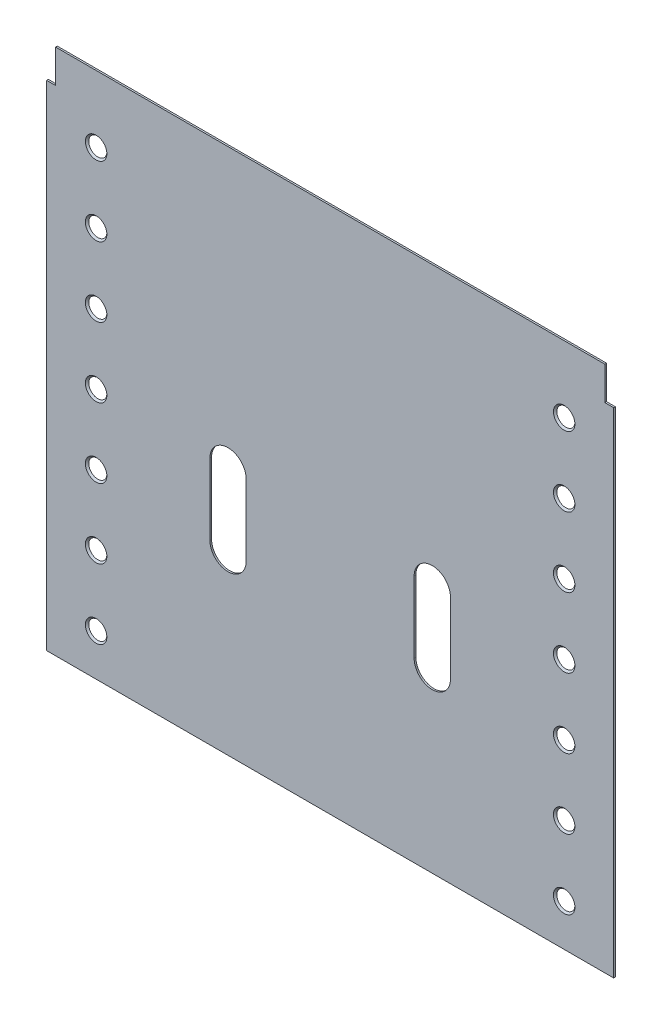
ISO-10303-21;
HEADER;
FILE_DESCRIPTION(('STEP AP214'),'2;1');
FILE_NAME('part.step','',(''),(''),'','','');
FILE_SCHEMA(('AUTOMOTIVE_DESIGN { 1 0 10303 214 1 1 1 1 }'));
ENDSEC;
DATA;
#1=APPLICATION_CONTEXT('core data for automotive mechanical design processes');
#2=APPLICATION_PROTOCOL_DEFINITION('international standard','automotive_design',2000,#1);
#3=PRODUCT_CONTEXT('',#1,'mechanical');
#4=PRODUCT('Part','Part','',(#3));
#5=PRODUCT_RELATED_PRODUCT_CATEGORY('part','',(#4));
#6=PRODUCT_DEFINITION_FORMATION('','',#4);
#7=PRODUCT_DEFINITION_CONTEXT('part definition',#1,'design');
#8=PRODUCT_DEFINITION('design','',#6,#7);
#9=PRODUCT_DEFINITION_SHAPE('','',#8);
#10=(LENGTH_UNIT() NAMED_UNIT(*) SI_UNIT(.MILLI.,.METRE.));
#11=(NAMED_UNIT(*) PLANE_ANGLE_UNIT() SI_UNIT($,.RADIAN.));
#12=(NAMED_UNIT(*) SI_UNIT($,.STERADIAN.) SOLID_ANGLE_UNIT());
#13=UNCERTAINTY_MEASURE_WITH_UNIT(LENGTH_MEASURE(1.E-05),#10,'distance_accuracy_value','');
#14=(GEOMETRIC_REPRESENTATION_CONTEXT(3) GLOBAL_UNCERTAINTY_ASSIGNED_CONTEXT((#13)) GLOBAL_UNIT_ASSIGNED_CONTEXT((#10,
#11,#12)) REPRESENTATION_CONTEXT('',''));
#15=CARTESIAN_POINT('',(0.,0.,0.));
#16=DIRECTION('',(0.,0.,1.));
#17=DIRECTION('',(1.,0.,0.));
#18=AXIS2_PLACEMENT_3D('',#15,#16,#17);
#19=CARTESIAN_POINT('',(0.,0.,-0.6096));
#20=DIRECTION('',(0.,0.,-1.));
#21=DIRECTION('',(-1.,0.,0.));
#22=AXIS2_PLACEMENT_3D('',#19,#20,#21);
#23=PLANE('',#22);
#24=CARTESIAN_POINT('',(-17.7299999994771,-222.000000003267,-0.6096));
#25=DIRECTION('',(0.,0.,-1.));
#26=DIRECTION('',(-1.,0.,0.));
#27=AXIS2_PLACEMENT_3D('',#24,#25,#26);
#28=CIRCLE('',#27,3.24040000000001);
#29=CARTESIAN_POINT('',(-20.9703999994771,-222.000000003267,-0.6096));
#30=VERTEX_POINT('',#29);
#31=EDGE_CURVE('E37',#30,#30,#28,.T.);
#32=ORIENTED_EDGE('',*,*,#31,.F.);
#33=EDGE_LOOP('',(#32));
#34=FACE_BOUND('',#33,.T.);
#35=CARTESIAN_POINT('',(-17.7299999965443,-147.00000000322,-0.6096));
#36=DIRECTION('',(0.,0.,-1.));
#37=DIRECTION('',(-1.,0.,0.));
#38=AXIS2_PLACEMENT_3D('',#35,#36,#37);
#39=CIRCLE('',#38,3.24040000000001);
#40=CARTESIAN_POINT('',(-20.9703999965444,-147.00000000322,-0.6096));
#41=VERTEX_POINT('',#40);
#42=EDGE_CURVE('E295',#41,#41,#39,.T.);
#43=ORIENTED_EDGE('',*,*,#42,.F.);
#44=EDGE_LOOP('',(#43));
#45=FACE_BOUND('',#44,.T.);
#46=CARTESIAN_POINT('',(-17.7299999955843,-122.00000000322,-0.6096));
#47=DIRECTION('',(0.,0.,-1.));
#48=DIRECTION('',(-1.,0.,0.));
#49=AXIS2_PLACEMENT_3D('',#46,#47,#48);
#50=CIRCLE('',#49,3.24040000000001);
#51=CARTESIAN_POINT('',(-20.9703999955843,-122.00000000322,-0.6096));
#52=VERTEX_POINT('',#51);
#53=EDGE_CURVE('E284',#52,#52,#50,.T.);
#54=ORIENTED_EDGE('',*,*,#53,.F.);
#55=EDGE_LOOP('',(#54));
#56=FACE_BOUND('',#55,.T.);
#57=CARTESIAN_POINT('',(-185.469999999947,-222.000000000047,-0.6096));
#58=DIRECTION('',(0.,0.,-1.));
#59=DIRECTION('',(-1.,0.,0.));
#60=AXIS2_PLACEMENT_3D('',#57,#58,#59);
#61=CIRCLE('',#60,3.2404);
#62=CARTESIAN_POINT('',(-188.710399999947,-222.000000000047,-0.6096));
#63=VERTEX_POINT('',#62);
#64=EDGE_CURVE('E325',#63,#63,#61,.T.);
#65=ORIENTED_EDGE('',*,*,#64,.F.);
#66=EDGE_LOOP('',(#65));
#67=FACE_BOUND('',#66,.T.);
#68=CARTESIAN_POINT('',(-185.47,-197.,-0.6096));
#69=DIRECTION('',(0.,0.,-1.));
#70=DIRECTION('',(-1.,0.,0.));
#71=AXIS2_PLACEMENT_3D('',#68,#69,#70);
#72=CIRCLE('',#71,3.2404);
#73=CARTESIAN_POINT('',(-188.7104,-197.,-0.6096));
#74=VERTEX_POINT('',#73);
#75=EDGE_CURVE('E331',#74,#74,#72,.T.);
#76=ORIENTED_EDGE('',*,*,#75,.F.);
#77=EDGE_LOOP('',(#76));
#78=FACE_BOUND('',#77,.T.);
#79=CARTESIAN_POINT('',(-185.47,-172.,-0.6096));
#80=DIRECTION('',(0.,0.,-1.));
#81=DIRECTION('',(-1.,0.,0.));
#82=AXIS2_PLACEMENT_3D('',#79,#80,#81);
#83=CIRCLE('',#82,3.2404);
#84=CARTESIAN_POINT('',(-188.7104,-172.,-0.6096));
#85=VERTEX_POINT('',#84);
#86=EDGE_CURVE('E337',#85,#85,#83,.T.);
#87=ORIENTED_EDGE('',*,*,#86,.F.);
#88=EDGE_LOOP('',(#87));
#89=FACE_BOUND('',#88,.T.);
#90=CARTESIAN_POINT('',(-185.47,-147.,-0.6096));
#91=DIRECTION('',(0.,0.,-1.));
#92=DIRECTION('',(-1.,0.,0.));
#93=AXIS2_PLACEMENT_3D('',#90,#91,#92);
#94=CIRCLE('',#93,3.2404);
#95=CARTESIAN_POINT('',(-188.7104,-147.,-0.6096));
#96=VERTEX_POINT('',#95);
#97=EDGE_CURVE('E343',#96,#96,#94,.T.);
#98=ORIENTED_EDGE('',*,*,#97,.F.);
#99=EDGE_LOOP('',(#98));
#100=FACE_BOUND('',#99,.T.);
#101=CARTESIAN_POINT('',(-185.47,-71.9999999999947,-0.6096));
#102=DIRECTION('',(0.,0.,-1.));
#103=DIRECTION('',(-1.,0.,0.));
#104=AXIS2_PLACEMENT_3D('',#101,#102,#103);
#105=CIRCLE('',#104,3.2404);
#106=CARTESIAN_POINT('',(-188.7104,-71.9999999999947,-0.6096));
#107=VERTEX_POINT('',#106);
#108=EDGE_CURVE('E182',#107,#107,#105,.T.);
#109=ORIENTED_EDGE('',*,*,#108,.F.);
#110=EDGE_LOOP('',(#109));
#111=FACE_BOUND('',#110,.T.);
#112=CARTESIAN_POINT('',(-138.2,-173.5,-0.609599999999979));
#113=DIRECTION('',(0.,0.,-1.));
#114=DIRECTION('',(0.,1.,0.));
#115=AXIS2_PLACEMENT_3D('',#112,#113,#114);
#116=CIRCLE('',#115,6.50000000000001);
#117=CARTESIAN_POINT('',(-131.7,-173.5,-0.609599999999979));
#118=VERTEX_POINT('',#117);
#119=CARTESIAN_POINT('',(-144.7,-173.5,-0.6096));
#120=VERTEX_POINT('',#119);
#121=EDGE_CURVE('E207',#118,#120,#116,.T.);
#122=ORIENTED_EDGE('',*,*,#121,.F.);
#123=DIRECTION('',(0.,-1.,0.));
#124=VECTOR('',#123,1.);
#125=CARTESIAN_POINT('',(-131.7,-173.5,-0.609599999999979));
#126=LINE('',#125,#124);
#127=CARTESIAN_POINT('',(-131.7,-148.,-0.609599999999982));
#128=VERTEX_POINT('',#127);
#129=EDGE_CURVE('E197',#128,#118,#126,.T.);
#130=ORIENTED_EDGE('',*,*,#129,.F.);
#131=CARTESIAN_POINT('',(-138.2,-148.,-0.609599999999982));
#132=DIRECTION('',(0.,0.,-1.));
#133=DIRECTION('',(0.,1.,0.));
#134=AXIS2_PLACEMENT_3D('',#131,#132,#133);
#135=CIRCLE('',#134,6.50000000000001);
#136=CARTESIAN_POINT('',(-144.7,-148.,-0.609599999999982));
#137=VERTEX_POINT('',#136);
#138=EDGE_CURVE('E213',#137,#128,#135,.T.);
#139=ORIENTED_EDGE('',*,*,#138,.F.);
#140=DIRECTION('',(0.,1.,0.));
#141=VECTOR('',#140,1.);
#142=CARTESIAN_POINT('',(-144.7,-173.5,-0.609599999999979));
#143=LINE('',#142,#141);
#144=EDGE_CURVE('E209',#120,#137,#143,.T.);
#145=ORIENTED_EDGE('',*,*,#144,.F.);
#146=EDGE_LOOP('',(#122,#130,#139,#145));
#147=FACE_BOUND('',#146,.T.);
#148=CARTESIAN_POINT('',(-65.,-173.5,-0.609599999999979));
#149=DIRECTION('',(0.,0.,-1.));
#150=DIRECTION('',(0.,1.,0.));
#151=AXIS2_PLACEMENT_3D('',#148,#149,#150);
#152=CIRCLE('',#151,6.50000000000003);
#153=CARTESIAN_POINT('',(-58.5,-173.5,-0.609599999999979));
#154=VERTEX_POINT('',#153);
#155=CARTESIAN_POINT('',(-71.5000000000001,-173.5,-0.6096));
#156=VERTEX_POINT('',#155);
#157=EDGE_CURVE('E192',#154,#156,#152,.T.);
#158=ORIENTED_EDGE('',*,*,#157,.F.);
#159=DIRECTION('',(0.,-1.,0.));
#160=VECTOR('',#159,1.);
#161=CARTESIAN_POINT('',(-58.5,-173.5,-0.609599999999979));
#162=LINE('',#161,#160);
#163=CARTESIAN_POINT('',(-58.5,-148.,-0.609599999999982));
#164=VERTEX_POINT('',#163);
#165=EDGE_CURVE('E231',#164,#154,#162,.T.);
#166=ORIENTED_EDGE('',*,*,#165,.F.);
#167=CARTESIAN_POINT('',(-65.,-148.,-0.609599999999982));
#168=DIRECTION('',(0.,0.,-1.));
#169=DIRECTION('',(0.,1.,0.));
#170=AXIS2_PLACEMENT_3D('',#167,#168,#169);
#171=CIRCLE('',#170,6.50000000000003);
#172=CARTESIAN_POINT('',(-71.5,-148.,-0.609599999999982));
#173=VERTEX_POINT('',#172);
#174=EDGE_CURVE('E245',#173,#164,#171,.T.);
#175=ORIENTED_EDGE('',*,*,#174,.F.);
#176=DIRECTION('',(0.,1.,0.));
#177=VECTOR('',#176,1.);
#178=CARTESIAN_POINT('',(-71.5000000000001,-173.5,-0.609599999999979));
#179=LINE('',#178,#177);
#180=EDGE_CURVE('E242',#156,#173,#179,.T.);
#181=ORIENTED_EDGE('',*,*,#180,.F.);
#182=EDGE_LOOP('',(#158,#166,#175,#181));
#183=FACE_BOUND('',#182,.T.);
#184=DIRECTION('',(0.,1.,0.));
#185=VECTOR('',#184,1.);
#186=CARTESIAN_POINT('',(-203.2,-237.,-0.6096));
#187=LINE('',#186,#185);
#188=CARTESIAN_POINT('',(-203.2,-237.,-0.6096));
#189=VERTEX_POINT('',#188);
#190=CARTESIAN_POINT('',(-203.2,-60.,-0.6096));
#191=VERTEX_POINT('',#190);
#192=EDGE_CURVE('E257',#189,#191,#187,.T.);
#193=ORIENTED_EDGE('',*,*,#192,.T.);
#194=DIRECTION('',(1.,0.,0.));
#195=VECTOR('',#194,1.);
#196=CARTESIAN_POINT('',(-203.2,-60.,-0.6096));
#197=LINE('',#196,#195);
#198=CARTESIAN_POINT('',(-200.025000000001,-60.,-0.6096));
#199=VERTEX_POINT('',#198);
#200=EDGE_CURVE('E261',#191,#199,#197,.T.);
#201=ORIENTED_EDGE('',*,*,#200,.T.);
#202=DIRECTION('',(0.,-1.,0.));
#203=VECTOR('',#202,1.);
#204=CARTESIAN_POINT('',(-200.025000000001,-60.,-0.609599999999988));
#205=LINE('',#204,#203);
#206=CARTESIAN_POINT('',(-200.025000000001,-48.062,-0.609599999999988));
#207=VERTEX_POINT('',#206);
#208=EDGE_CURVE('E163',#207,#199,#205,.T.);
#209=ORIENTED_EDGE('',*,*,#208,.F.);
#210=DIRECTION('',(-1.,0.,0.));
#211=VECTOR('',#210,1.);
#212=CARTESIAN_POINT('',(-3.17500000000001,-48.062,-0.609599999999988));
#213=LINE('',#212,#211);
#214=CARTESIAN_POINT('',(-3.17500000000001,-48.062,-0.609599999999988));
#215=VERTEX_POINT('',#214);
#216=EDGE_CURVE('E171',#215,#207,#213,.T.);
#217=ORIENTED_EDGE('',*,*,#216,.F.);
#218=DIRECTION('',(0.,1.,0.));
#219=VECTOR('',#218,1.);
#220=CARTESIAN_POINT('',(-3.17500000000001,-60.,-0.609599999999988));
#221=LINE('',#220,#219);
#222=CARTESIAN_POINT('',(-3.17500000000001,-60.,-0.6096));
#223=VERTEX_POINT('',#222);
#224=EDGE_CURVE('E184',#223,#215,#221,.T.);
#225=ORIENTED_EDGE('',*,*,#224,.F.);
#226=CARTESIAN_POINT('',(0.,-60.,-0.6096));
#227=VERTEX_POINT('',#226);
#228=EDGE_CURVE('E50',#223,#227,#197,.T.);
#229=ORIENTED_EDGE('',*,*,#228,.T.);
#230=DIRECTION('',(0.,-1.,0.));
#231=VECTOR('',#230,1.);
#232=CARTESIAN_POINT('',(0.,-237.,-0.6096));
#233=LINE('',#232,#231);
#234=CARTESIAN_POINT('',(0.,-237.,-0.6096));
#235=VERTEX_POINT('',#234);
#236=EDGE_CURVE('E263',#227,#235,#233,.T.);
#237=ORIENTED_EDGE('',*,*,#236,.T.);
#238=DIRECTION('',(-1.,0.,0.));
#239=VECTOR('',#238,1.);
#240=CARTESIAN_POINT('',(-203.2,-237.,-0.6096));
#241=LINE('',#240,#239);
#242=EDGE_CURVE('E265',#235,#189,#241,.T.);
#243=ORIENTED_EDGE('',*,*,#242,.T.);
#244=EDGE_LOOP('',(#193,#201,#209,#217,#225,#229,#237,#243));
#245=FACE_BOUND('',#244,.T.);
#246=CARTESIAN_POINT('',(-185.47,-96.9999999999999,-0.6096));
#247=DIRECTION('',(0.,0.,-1.));
#248=DIRECTION('',(-1.,0.,0.));
#249=AXIS2_PLACEMENT_3D('',#246,#247,#248);
#250=CIRCLE('',#249,3.2404);
#251=CARTESIAN_POINT('',(-188.7104,-96.9999999999999,-0.6096));
#252=VERTEX_POINT('',#251);
#253=EDGE_CURVE('E280',#252,#252,#250,.T.);
#254=ORIENTED_EDGE('',*,*,#253,.F.);
#255=EDGE_LOOP('',(#254));
#256=FACE_BOUND('',#255,.T.);
#257=CARTESIAN_POINT('',(-185.47,-122.,-0.6096));
#258=DIRECTION('',(0.,0.,-1.));
#259=DIRECTION('',(-1.,0.,0.));
#260=AXIS2_PLACEMENT_3D('',#257,#258,#259);
#261=CIRCLE('',#260,3.2404);
#262=CARTESIAN_POINT('',(-188.7104,-122.,-0.6096));
#263=VERTEX_POINT('',#262);
#264=EDGE_CURVE('E349',#263,#263,#261,.T.);
#265=ORIENTED_EDGE('',*,*,#264,.F.);
#266=EDGE_LOOP('',(#265));
#267=FACE_BOUND('',#266,.T.);
#268=CARTESIAN_POINT('',(-17.7299999936645,-72.0000000032152,-0.6096));
#269=DIRECTION('',(0.,0.,-1.));
#270=DIRECTION('',(-1.,0.,0.));
#271=AXIS2_PLACEMENT_3D('',#268,#269,#270);
#272=CIRCLE('',#271,3.24040000000001);
#273=CARTESIAN_POINT('',(-20.9703999936645,-72.0000000032152,-0.6096));
#274=VERTEX_POINT('',#273);
#275=EDGE_CURVE('E319',#274,#274,#272,.T.);
#276=ORIENTED_EDGE('',*,*,#275,.F.);
#277=EDGE_LOOP('',(#276));
#278=FACE_BOUND('',#277,.T.);
#279=CARTESIAN_POINT('',(-17.7299999946244,-97.0000000032204,-0.6096));
#280=DIRECTION('',(0.,0.,-1.));
#281=DIRECTION('',(-1.,0.,0.));
#282=AXIS2_PLACEMENT_3D('',#279,#280,#281);
#283=CIRCLE('',#282,3.24040000000001);
#284=CARTESIAN_POINT('',(-20.9703999946244,-97.0000000032204,-0.6096));
#285=VERTEX_POINT('',#284);
#286=EDGE_CURVE('E313',#285,#285,#283,.T.);
#287=ORIENTED_EDGE('',*,*,#286,.F.);
#288=EDGE_LOOP('',(#287));
#289=FACE_BOUND('',#288,.T.);
#290=CARTESIAN_POINT('',(-17.7299999975043,-172.00000000322,-0.6096));
#291=DIRECTION('',(0.,0.,-1.));
#292=DIRECTION('',(-1.,0.,0.));
#293=AXIS2_PLACEMENT_3D('',#290,#291,#292);
#294=CIRCLE('',#293,3.24040000000001);
#295=CARTESIAN_POINT('',(-20.9703999975043,-172.00000000322,-0.6096));
#296=VERTEX_POINT('',#295);
#297=EDGE_CURVE('E288',#296,#296,#294,.T.);
#298=ORIENTED_EDGE('',*,*,#297,.F.);
#299=EDGE_LOOP('',(#298));
#300=FACE_BOUND('',#299,.T.);
#301=CARTESIAN_POINT('',(-17.7299999984643,-197.00000000322,-0.6096));
#302=DIRECTION('',(0.,0.,-1.));
#303=DIRECTION('',(-1.,0.,0.));
#304=AXIS2_PLACEMENT_3D('',#301,#302,#303);
#305=CIRCLE('',#304,3.24040000000001);
#306=CARTESIAN_POINT('',(-20.9703999984643,-197.00000000322,-0.6096));
#307=VERTEX_POINT('',#306);
#308=EDGE_CURVE('E298',#307,#307,#305,.T.);
#309=ORIENTED_EDGE('',*,*,#308,.F.);
#310=EDGE_LOOP('',(#309));
#311=FACE_BOUND('',#310,.T.);
#312=ADVANCED_FACE('F33',(#34,#45,#56,#67,#78,#89,#100,#111,#147,#183,#245,#256,#267,#278,#289,
#300,#311),#23,.T.);
#313=CARTESIAN_POINT('',(0.,0.,0.));
#314=DIRECTION('',(0.,0.,-1.));
#315=DIRECTION('',(-1.,0.,0.));
#316=AXIS2_PLACEMENT_3D('',#313,#314,#315);
#317=PLANE('',#316);
#318=CARTESIAN_POINT('',(-17.7299999994771,-222.000000003267,0.));
#319=DIRECTION('',(0.,0.,1.));
#320=DIRECTION('',(0.,-1.,0.));
#321=AXIS2_PLACEMENT_3D('',#318,#319,#320);
#322=CIRCLE('',#321,3.85);
#323=CARTESIAN_POINT('',(-17.7299999994771,-225.850000003267,0.));
#324=VERTEX_POINT('',#323);
#325=EDGE_CURVE('E670',#324,#324,#322,.T.);
#326=ORIENTED_EDGE('',*,*,#325,.F.);
#327=EDGE_LOOP('',(#326));
#328=FACE_BOUND('',#327,.T.);
#329=CARTESIAN_POINT('',(-17.7299999975043,-172.00000000322,0.));
#330=DIRECTION('',(0.,0.,1.));
#331=DIRECTION('',(0.,-1.,0.));
#332=AXIS2_PLACEMENT_3D('',#329,#330,#331);
#333=CIRCLE('',#332,3.85);
#334=CARTESIAN_POINT('',(-17.7299999975043,-175.85000000322,0.));
#335=VERTEX_POINT('',#334);
#336=EDGE_CURVE('E291',#335,#335,#333,.T.);
#337=ORIENTED_EDGE('',*,*,#336,.F.);
#338=EDGE_LOOP('',(#337));
#339=FACE_BOUND('',#338,.T.);
#340=CARTESIAN_POINT('',(-17.7299999955843,-122.00000000322,0.));
#341=DIRECTION('',(0.,0.,1.));
#342=DIRECTION('',(0.,-1.,0.));
#343=AXIS2_PLACEMENT_3D('',#340,#341,#342);
#344=CIRCLE('',#343,3.85);
#345=CARTESIAN_POINT('',(-17.7299999955843,-125.85000000322,0.));
#346=VERTEX_POINT('',#345);
#347=EDGE_CURVE('E287',#346,#346,#344,.T.);
#348=ORIENTED_EDGE('',*,*,#347,.F.);
#349=EDGE_LOOP('',(#348));
#350=FACE_BOUND('',#349,.T.);
#351=CARTESIAN_POINT('',(-185.469999999947,-222.000000000047,0.));
#352=DIRECTION('',(0.,0.,1.));
#353=DIRECTION('',(1.,0.,0.));
#354=AXIS2_PLACEMENT_3D('',#351,#352,#353);
#355=CIRCLE('',#354,3.84999999999999);
#356=CARTESIAN_POINT('',(-181.619999999947,-222.000000000047,0.));
#357=VERTEX_POINT('',#356);
#358=EDGE_CURVE('E322',#357,#357,#355,.T.);
#359=ORIENTED_EDGE('',*,*,#358,.F.);
#360=EDGE_LOOP('',(#359));
#361=FACE_BOUND('',#360,.T.);
#362=CARTESIAN_POINT('',(-185.47,-197.,0.));
#363=DIRECTION('',(0.,0.,1.));
#364=DIRECTION('',(1.,0.,0.));
#365=AXIS2_PLACEMENT_3D('',#362,#363,#364);
#366=CIRCLE('',#365,3.84999999999999);
#367=CARTESIAN_POINT('',(-181.62,-197.,0.));
#368=VERTEX_POINT('',#367);
#369=EDGE_CURVE('E328',#368,#368,#366,.T.);
#370=ORIENTED_EDGE('',*,*,#369,.F.);
#371=EDGE_LOOP('',(#370));
#372=FACE_BOUND('',#371,.T.);
#373=CARTESIAN_POINT('',(-185.47,-172.,0.));
#374=DIRECTION('',(0.,0.,1.));
#375=DIRECTION('',(1.,0.,0.));
#376=AXIS2_PLACEMENT_3D('',#373,#374,#375);
#377=CIRCLE('',#376,3.84999999999999);
#378=CARTESIAN_POINT('',(-181.62,-172.,0.));
#379=VERTEX_POINT('',#378);
#380=EDGE_CURVE('E334',#379,#379,#377,.T.);
#381=ORIENTED_EDGE('',*,*,#380,.F.);
#382=EDGE_LOOP('',(#381));
#383=FACE_BOUND('',#382,.T.);
#384=CARTESIAN_POINT('',(-185.47,-147.,0.));
#385=DIRECTION('',(0.,0.,1.));
#386=DIRECTION('',(1.,0.,0.));
#387=AXIS2_PLACEMENT_3D('',#384,#385,#386);
#388=CIRCLE('',#387,3.84999999999999);
#389=CARTESIAN_POINT('',(-181.62,-147.,0.));
#390=VERTEX_POINT('',#389);
#391=EDGE_CURVE('E340',#390,#390,#388,.T.);
#392=ORIENTED_EDGE('',*,*,#391,.F.);
#393=EDGE_LOOP('',(#392));
#394=FACE_BOUND('',#393,.T.);
#395=CARTESIAN_POINT('',(-185.47,-122.,0.));
#396=DIRECTION('',(0.,0.,1.));
#397=DIRECTION('',(1.,0.,0.));
#398=AXIS2_PLACEMENT_3D('',#395,#396,#397);
#399=CIRCLE('',#398,3.84999999999999);
#400=CARTESIAN_POINT('',(-181.62,-122.,0.));
#401=VERTEX_POINT('',#400);
#402=EDGE_CURVE('E346',#401,#401,#399,.T.);
#403=ORIENTED_EDGE('',*,*,#402,.F.);
#404=EDGE_LOOP('',(#403));
#405=FACE_BOUND('',#404,.T.);
#406=CARTESIAN_POINT('',(-185.47,-96.9999999999999,0.));
#407=DIRECTION('',(0.,0.,1.));
#408=DIRECTION('',(1.,0.,0.));
#409=AXIS2_PLACEMENT_3D('',#406,#407,#408);
#410=CIRCLE('',#409,3.84999999999999);
#411=CARTESIAN_POINT('',(-181.62,-96.9999999999999,0.));
#412=VERTEX_POINT('',#411);
#413=EDGE_CURVE('E283',#412,#412,#410,.T.);
#414=ORIENTED_EDGE('',*,*,#413,.F.);
#415=EDGE_LOOP('',(#414));
#416=FACE_BOUND('',#415,.T.);
#417=CARTESIAN_POINT('',(-185.47,-71.9999999999947,0.));
#418=DIRECTION('',(0.,0.,1.));
#419=DIRECTION('',(1.,0.,0.));
#420=AXIS2_PLACEMENT_3D('',#417,#418,#419);
#421=CIRCLE('',#420,3.84999999999999);
#422=CARTESIAN_POINT('',(-181.62,-71.9999999999947,0.));
#423=VERTEX_POINT('',#422);
#424=EDGE_CURVE('E179',#423,#423,#421,.T.);
#425=ORIENTED_EDGE('',*,*,#424,.F.);
#426=EDGE_LOOP('',(#425));
#427=FACE_BOUND('',#426,.T.);
#428=DIRECTION('',(1.,0.,0.));
#429=VECTOR('',#428,1.);
#430=CARTESIAN_POINT('',(-203.2,-60.,0.));
#431=LINE('',#430,#429);
#432=CARTESIAN_POINT('',(-3.17500000000001,-60.,0.));
#433=VERTEX_POINT('',#432);
#434=CARTESIAN_POINT('',(0.,-60.,0.));
#435=VERTEX_POINT('',#434);
#436=EDGE_CURVE('E154',#433,#435,#431,.T.);
#437=ORIENTED_EDGE('',*,*,#436,.F.);
#438=DIRECTION('',(0.,1.,0.));
#439=VECTOR('',#438,1.);
#440=CARTESIAN_POINT('',(-3.17500000000001,-60.,0.));
#441=LINE('',#440,#439);
#442=CARTESIAN_POINT('',(-3.17500000000001,-48.062,0.));
#443=VERTEX_POINT('',#442);
#444=EDGE_CURVE('E176',#433,#443,#441,.T.);
#445=ORIENTED_EDGE('',*,*,#444,.T.);
#446=DIRECTION('',(-1.,0.,0.));
#447=VECTOR('',#446,1.);
#448=CARTESIAN_POINT('',(-3.17500000000001,-48.062,0.));
#449=LINE('',#448,#447);
#450=CARTESIAN_POINT('',(-200.025000000001,-48.062,0.));
#451=VERTEX_POINT('',#450);
#452=EDGE_CURVE('E170',#443,#451,#449,.T.);
#453=ORIENTED_EDGE('',*,*,#452,.T.);
#454=DIRECTION('',(0.,-1.,0.));
#455=VECTOR('',#454,1.);
#456=CARTESIAN_POINT('',(-200.025000000001,-60.,0.));
#457=LINE('',#456,#455);
#458=CARTESIAN_POINT('',(-200.025000000001,-60.,0.));
#459=VERTEX_POINT('',#458);
#460=EDGE_CURVE('E161',#451,#459,#457,.T.);
#461=ORIENTED_EDGE('',*,*,#460,.T.);
#462=CARTESIAN_POINT('',(-203.2,-60.,0.));
#463=VERTEX_POINT('',#462);
#464=EDGE_CURVE('E146',#463,#459,#431,.T.);
#465=ORIENTED_EDGE('',*,*,#464,.F.);
#466=DIRECTION('',(0.,1.,0.));
#467=VECTOR('',#466,1.);
#468=CARTESIAN_POINT('',(-203.2,-237.,0.));
#469=LINE('',#468,#467);
#470=CARTESIAN_POINT('',(-203.2,-237.,0.));
#471=VERTEX_POINT('',#470);
#472=EDGE_CURVE('E220',#471,#463,#469,.T.);
#473=ORIENTED_EDGE('',*,*,#472,.F.);
#474=DIRECTION('',(-1.,0.,0.));
#475=VECTOR('',#474,1.);
#476=CARTESIAN_POINT('',(-203.2,-237.,0.));
#477=LINE('',#476,#475);
#478=CARTESIAN_POINT('',(0.,-237.,0.));
#479=VERTEX_POINT('',#478);
#480=EDGE_CURVE('E260',#479,#471,#477,.T.);
#481=ORIENTED_EDGE('',*,*,#480,.F.);
#482=DIRECTION('',(0.,-1.,0.));
#483=VECTOR('',#482,1.);
#484=CARTESIAN_POINT('',(0.,-237.,0.));
#485=LINE('',#484,#483);
#486=EDGE_CURVE('E153',#435,#479,#485,.T.);
#487=ORIENTED_EDGE('',*,*,#486,.F.);
#488=EDGE_LOOP('',(#437,#445,#453,#461,#465,#473,#481,#487));
#489=FACE_BOUND('',#488,.T.);
#490=DIRECTION('',(0.,-1.,0.));
#491=VECTOR('',#490,1.);
#492=CARTESIAN_POINT('',(-58.5,-173.5,0.));
#493=LINE('',#492,#491);
#494=CARTESIAN_POINT('',(-58.5,-148.,0.));
#495=VERTEX_POINT('',#494);
#496=CARTESIAN_POINT('',(-58.5,-173.5,0.));
#497=VERTEX_POINT('',#496);
#498=EDGE_CURVE('E237',#495,#497,#493,.T.);
#499=ORIENTED_EDGE('',*,*,#498,.T.);
#500=CARTESIAN_POINT('',(-65.,-173.5,0.));
#501=DIRECTION('',(0.,0.,-1.));
#502=DIRECTION('',(0.,1.,0.));
#503=AXIS2_PLACEMENT_3D('',#500,#501,#502);
#504=CIRCLE('',#503,6.50000000000003);
#505=CARTESIAN_POINT('',(-71.5000000000001,-173.5,0.));
#506=VERTEX_POINT('',#505);
#507=EDGE_CURVE('E227',#497,#506,#504,.T.);
#508=ORIENTED_EDGE('',*,*,#507,.T.);
#509=DIRECTION('',(0.,1.,0.));
#510=VECTOR('',#509,1.);
#511=CARTESIAN_POINT('',(-71.5000000000001,-173.5,0.));
#512=LINE('',#511,#510);
#513=CARTESIAN_POINT('',(-71.5,-148.,0.));
#514=VERTEX_POINT('',#513);
#515=EDGE_CURVE('E230',#506,#514,#512,.T.);
#516=ORIENTED_EDGE('',*,*,#515,.T.);
#517=CARTESIAN_POINT('',(-65.,-148.,0.));
#518=DIRECTION('',(0.,0.,-1.));
#519=DIRECTION('',(0.,1.,0.));
#520=AXIS2_PLACEMENT_3D('',#517,#518,#519);
#521=CIRCLE('',#520,6.50000000000003);
#522=EDGE_CURVE('E234',#514,#495,#521,.T.);
#523=ORIENTED_EDGE('',*,*,#522,.T.);
#524=EDGE_LOOP('',(#499,#508,#516,#523));
#525=FACE_BOUND('',#524,.T.);
#526=DIRECTION('',(0.,-1.,0.));
#527=VECTOR('',#526,1.);
#528=CARTESIAN_POINT('',(-131.7,-173.5,0.));
#529=LINE('',#528,#527);
#530=CARTESIAN_POINT('',(-131.7,-148.,0.));
#531=VERTEX_POINT('',#530);
#532=CARTESIAN_POINT('',(-131.7,-173.5,0.));
#533=VERTEX_POINT('',#532);
#534=EDGE_CURVE('E203',#531,#533,#529,.T.);
#535=ORIENTED_EDGE('',*,*,#534,.T.);
#536=CARTESIAN_POINT('',(-138.2,-173.5,0.));
#537=DIRECTION('',(0.,0.,-1.));
#538=DIRECTION('',(0.,1.,0.));
#539=AXIS2_PLACEMENT_3D('',#536,#537,#538);
#540=CIRCLE('',#539,6.50000000000001);
#541=CARTESIAN_POINT('',(-144.7,-173.5,0.));
#542=VERTEX_POINT('',#541);
#543=EDGE_CURVE('E193',#533,#542,#540,.T.);
#544=ORIENTED_EDGE('',*,*,#543,.T.);
#545=DIRECTION('',(0.,1.,0.));
#546=VECTOR('',#545,1.);
#547=CARTESIAN_POINT('',(-144.7,-173.5,0.));
#548=LINE('',#547,#546);
#549=CARTESIAN_POINT('',(-144.7,-148.,0.));
#550=VERTEX_POINT('',#549);
#551=EDGE_CURVE('E196',#542,#550,#548,.T.);
#552=ORIENTED_EDGE('',*,*,#551,.T.);
#553=CARTESIAN_POINT('',(-138.2,-148.,0.));
#554=DIRECTION('',(0.,0.,-1.));
#555=DIRECTION('',(0.,1.,0.));
#556=AXIS2_PLACEMENT_3D('',#553,#554,#555);
#557=CIRCLE('',#556,6.50000000000001);
#558=EDGE_CURVE('E200',#550,#531,#557,.T.);
#559=ORIENTED_EDGE('',*,*,#558,.T.);
#560=EDGE_LOOP('',(#535,#544,#552,#559));
#561=FACE_BOUND('',#560,.T.);
#562=CARTESIAN_POINT('',(-17.7299999936645,-72.0000000032152,0.));
#563=DIRECTION('',(0.,0.,1.));
#564=DIRECTION('',(0.,-1.,0.));
#565=AXIS2_PLACEMENT_3D('',#562,#563,#564);
#566=CIRCLE('',#565,3.85);
#567=CARTESIAN_POINT('',(-17.7299999936645,-75.8500000032152,0.));
#568=VERTEX_POINT('',#567);
#569=EDGE_CURVE('E316',#568,#568,#566,.T.);
#570=ORIENTED_EDGE('',*,*,#569,.F.);
#571=EDGE_LOOP('',(#570));
#572=FACE_BOUND('',#571,.T.);
#573=CARTESIAN_POINT('',(-17.7299999946244,-97.0000000032204,0.));
#574=DIRECTION('',(0.,0.,1.));
#575=DIRECTION('',(0.,-1.,0.));
#576=AXIS2_PLACEMENT_3D('',#573,#574,#575);
#577=CIRCLE('',#576,3.85);
#578=CARTESIAN_POINT('',(-17.7299999946244,-100.85000000322,0.));
#579=VERTEX_POINT('',#578);
#580=EDGE_CURVE('E286',#579,#579,#577,.T.);
#581=ORIENTED_EDGE('',*,*,#580,.F.);
#582=EDGE_LOOP('',(#581));
#583=FACE_BOUND('',#582,.T.);
#584=CARTESIAN_POINT('',(-17.7299999965443,-147.00000000322,0.));
#585=DIRECTION('',(0.,0.,1.));
#586=DIRECTION('',(0.,-1.,0.));
#587=AXIS2_PLACEMENT_3D('',#584,#585,#586);
#588=CIRCLE('',#587,3.85);
#589=CARTESIAN_POINT('',(-17.7299999965443,-150.85000000322,0.));
#590=VERTEX_POINT('',#589);
#591=EDGE_CURVE('E290',#590,#590,#588,.T.);
#592=ORIENTED_EDGE('',*,*,#591,.F.);
#593=EDGE_LOOP('',(#592));
#594=FACE_BOUND('',#593,.T.);
#595=CARTESIAN_POINT('',(-17.7299999984643,-197.00000000322,0.));
#596=DIRECTION('',(0.,0.,1.));
#597=DIRECTION('',(0.,-1.,0.));
#598=AXIS2_PLACEMENT_3D('',#595,#596,#597);
#599=CIRCLE('',#598,3.85);
#600=CARTESIAN_POINT('',(-17.7299999984643,-200.85000000322,0.));
#601=VERTEX_POINT('',#600);
#602=EDGE_CURVE('E303',#601,#601,#599,.T.);
#603=ORIENTED_EDGE('',*,*,#602,.F.);
#604=EDGE_LOOP('',(#603));
#605=FACE_BOUND('',#604,.T.);
#606=ADVANCED_FACE('F166',(#328,#339,#350,#361,#372,#383,#394,#405,#416,#427,#489,#525,#561,
#572,#583,#594,#605),#317,.F.);
#607=CARTESIAN_POINT('',(-203.2,-60.,-0.6096));
#608=DIRECTION('',(0.,-1.,0.));
#609=DIRECTION('',(1.,0.,0.));
#610=AXIS2_PLACEMENT_3D('',#607,#608,#609);
#611=PLANE('',#610);
#612=DIRECTION('',(0.,0.,1.));
#613=VECTOR('',#612,1.);
#614=CARTESIAN_POINT('',(-200.025000000001,-60.,-197.821258742581));
#615=LINE('',#614,#613);
#616=EDGE_CURVE('E58',#199,#459,#615,.T.);
#617=ORIENTED_EDGE('',*,*,#616,.F.);
#618=ORIENTED_EDGE('',*,*,#200,.F.);
#619=DIRECTION('',(0.,0.,1.));
#620=VECTOR('',#619,1.);
#621=CARTESIAN_POINT('',(-203.2,-60.,-0.6096));
#622=LINE('',#621,#620);
#623=EDGE_CURVE('E11',#191,#463,#622,.T.);
#624=ORIENTED_EDGE('',*,*,#623,.T.);
#625=ORIENTED_EDGE('',*,*,#464,.T.);
#626=EDGE_LOOP('',(#617,#618,#624,#625));
#627=FACE_BOUND('',#626,.T.);
#628=ADVANCED_FACE('F147',(#627),#611,.F.);
#629=CARTESIAN_POINT('',(-203.2,-237.,-0.6096));
#630=DIRECTION('',(1.,0.,0.));
#631=DIRECTION('',(0.,1.,0.));
#632=AXIS2_PLACEMENT_3D('',#629,#630,#631);
#633=PLANE('',#632);
#634=ORIENTED_EDGE('',*,*,#472,.T.);
#635=ORIENTED_EDGE('',*,*,#623,.F.);
#636=ORIENTED_EDGE('',*,*,#192,.F.);
#637=DIRECTION('',(0.,0.,1.));
#638=VECTOR('',#637,1.);
#639=CARTESIAN_POINT('',(-203.2,-237.,-0.6096));
#640=LINE('',#639,#638);
#641=EDGE_CURVE('E267',#189,#471,#640,.T.);
#642=ORIENTED_EDGE('',*,*,#641,.T.);
#643=EDGE_LOOP('',(#634,#635,#636,#642));
#644=FACE_BOUND('',#643,.T.);
#645=ADVANCED_FACE('F35',(#644),#633,.F.);
#646=ORIENTED_EDGE('',*,*,#228,.F.);
#647=DIRECTION('',(0.,0.,1.));
#648=VECTOR('',#647,1.);
#649=CARTESIAN_POINT('',(-3.17500000000001,-60.,-197.821258742581));
#650=LINE('',#649,#648);
#651=EDGE_CURVE('E164',#223,#433,#650,.T.);
#652=ORIENTED_EDGE('',*,*,#651,.T.);
#653=ORIENTED_EDGE('',*,*,#436,.T.);
#654=DIRECTION('',(0.,0.,1.));
#655=VECTOR('',#654,1.);
#656=CARTESIAN_POINT('',(0.,-60.,-0.6096));
#657=LINE('',#656,#655);
#658=EDGE_CURVE('E42',#227,#435,#657,.T.);
#659=ORIENTED_EDGE('',*,*,#658,.F.);
#660=EDGE_LOOP('',(#646,#652,#653,#659));
#661=FACE_BOUND('',#660,.T.);
#662=ADVANCED_FACE('F394',(#661),#611,.F.);
#663=CARTESIAN_POINT('',(0.,-237.,-0.6096));
#664=DIRECTION('',(-1.,0.,0.));
#665=DIRECTION('',(0.,-1.,0.));
#666=AXIS2_PLACEMENT_3D('',#663,#664,#665);
#667=PLANE('',#666);
#668=ORIENTED_EDGE('',*,*,#486,.T.);
#669=DIRECTION('',(0.,0.,1.));
#670=VECTOR('',#669,1.);
#671=CARTESIAN_POINT('',(0.,-237.,-0.6096));
#672=LINE('',#671,#670);
#673=EDGE_CURVE('E273',#235,#479,#672,.T.);
#674=ORIENTED_EDGE('',*,*,#673,.F.);
#675=ORIENTED_EDGE('',*,*,#236,.F.);
#676=ORIENTED_EDGE('',*,*,#658,.T.);
#677=EDGE_LOOP('',(#668,#674,#675,#676));
#678=FACE_BOUND('',#677,.T.);
#679=ADVANCED_FACE('F391',(#678),#667,.F.);
#680=CARTESIAN_POINT('',(-203.2,-237.,-0.6096));
#681=DIRECTION('',(0.,1.,0.));
#682=DIRECTION('',(0.,0.,1.));
#683=AXIS2_PLACEMENT_3D('',#680,#681,#682);
#684=PLANE('',#683);
#685=ORIENTED_EDGE('',*,*,#480,.T.);
#686=ORIENTED_EDGE('',*,*,#641,.F.);
#687=ORIENTED_EDGE('',*,*,#242,.F.);
#688=ORIENTED_EDGE('',*,*,#673,.T.);
#689=EDGE_LOOP('',(#685,#686,#687,#688));
#690=FACE_BOUND('',#689,.T.);
#691=ADVANCED_FACE('F388',(#690),#684,.F.);
#692=CARTESIAN_POINT('',(-65.,-173.5,0.));
#693=DIRECTION('',(0.,0.,-1.));
#694=DIRECTION('',(0.,1.,0.));
#695=AXIS2_PLACEMENT_3D('',#692,#693,#694);
#696=CYLINDRICAL_SURFACE('',#695,6.50000000000003);
#697=ORIENTED_EDGE('',*,*,#157,.T.);
#698=DIRECTION('',(0.,0.,-1.));
#699=VECTOR('',#698,1.);
#700=CARTESIAN_POINT('',(-71.5000000000001,-173.5,0.));
#701=LINE('',#700,#699);
#702=EDGE_CURVE('E240',#506,#156,#701,.T.);
#703=ORIENTED_EDGE('',*,*,#702,.F.);
#704=ORIENTED_EDGE('',*,*,#507,.F.);
#705=DIRECTION('',(0.,0.,-1.));
#706=VECTOR('',#705,1.);
#707=CARTESIAN_POINT('',(-58.5,-173.5,0.));
#708=LINE('',#707,#706);
#709=EDGE_CURVE('E210',#497,#154,#708,.T.);
#710=ORIENTED_EDGE('',*,*,#709,.T.);
#711=EDGE_LOOP('',(#697,#703,#704,#710));
#712=FACE_BOUND('',#711,.T.);
#713=ADVANCED_FACE('F385',(#712),#696,.F.);
#714=CARTESIAN_POINT('',(-58.5,-173.5,0.));
#715=DIRECTION('',(1.,0.,0.));
#716=DIRECTION('',(0.,1.,0.));
#717=AXIS2_PLACEMENT_3D('',#714,#715,#716);
#718=PLANE('',#717);
#719=ORIENTED_EDGE('',*,*,#165,.T.);
#720=ORIENTED_EDGE('',*,*,#709,.F.);
#721=ORIENTED_EDGE('',*,*,#498,.F.);
#722=DIRECTION('',(0.,0.,-1.));
#723=VECTOR('',#722,1.);
#724=CARTESIAN_POINT('',(-58.5,-148.,0.));
#725=LINE('',#724,#723);
#726=EDGE_CURVE('E251',#495,#164,#725,.T.);
#727=ORIENTED_EDGE('',*,*,#726,.T.);
#728=EDGE_LOOP('',(#719,#720,#721,#727));
#729=FACE_BOUND('',#728,.T.);
#730=ADVANCED_FACE('F433',(#729),#718,.F.);
#731=CARTESIAN_POINT('',(-65.,-148.,0.));
#732=DIRECTION('',(0.,0.,-1.));
#733=DIRECTION('',(0.,1.,0.));
#734=AXIS2_PLACEMENT_3D('',#731,#732,#733);
#735=CYLINDRICAL_SURFACE('',#734,6.50000000000003);
#736=ORIENTED_EDGE('',*,*,#174,.T.);
#737=ORIENTED_EDGE('',*,*,#726,.F.);
#738=ORIENTED_EDGE('',*,*,#522,.F.);
#739=DIRECTION('',(0.,0.,-1.));
#740=VECTOR('',#739,1.);
#741=CARTESIAN_POINT('',(-71.5,-148.,0.));
#742=LINE('',#741,#740);
#743=EDGE_CURVE('E253',#514,#173,#742,.T.);
#744=ORIENTED_EDGE('',*,*,#743,.T.);
#745=EDGE_LOOP('',(#736,#737,#738,#744));
#746=FACE_BOUND('',#745,.T.);
#747=ADVANCED_FACE('F442',(#746),#735,.F.);
#748=CARTESIAN_POINT('',(-71.5000000000001,-173.5,0.));
#749=DIRECTION('',(-1.,0.,0.));
#750=DIRECTION('',(0.,-1.,0.));
#751=AXIS2_PLACEMENT_3D('',#748,#749,#750);
#752=PLANE('',#751);
#753=ORIENTED_EDGE('',*,*,#180,.T.);
#754=ORIENTED_EDGE('',*,*,#743,.F.);
#755=ORIENTED_EDGE('',*,*,#515,.F.);
#756=ORIENTED_EDGE('',*,*,#702,.T.);
#757=EDGE_LOOP('',(#753,#754,#755,#756));
#758=FACE_BOUND('',#757,.T.);
#759=ADVANCED_FACE('F452',(#758),#752,.F.);
#760=CARTESIAN_POINT('',(-138.2,-173.5,0.));
#761=DIRECTION('',(0.,0.,-1.));
#762=DIRECTION('',(0.,1.,0.));
#763=AXIS2_PLACEMENT_3D('',#760,#761,#762);
#764=CYLINDRICAL_SURFACE('',#763,6.50000000000001);
#765=ORIENTED_EDGE('',*,*,#121,.T.);
#766=DIRECTION('',(0.,0.,-1.));
#767=VECTOR('',#766,1.);
#768=CARTESIAN_POINT('',(-144.7,-173.5,0.));
#769=LINE('',#768,#767);
#770=EDGE_CURVE('E206',#542,#120,#769,.T.);
#771=ORIENTED_EDGE('',*,*,#770,.F.);
#772=ORIENTED_EDGE('',*,*,#543,.F.);
#773=DIRECTION('',(0.,0.,-1.));
#774=VECTOR('',#773,1.);
#775=CARTESIAN_POINT('',(-131.7,-173.5,0.));
#776=LINE('',#775,#774);
#777=EDGE_CURVE('E218',#533,#118,#776,.T.);
#778=ORIENTED_EDGE('',*,*,#777,.T.);
#779=EDGE_LOOP('',(#765,#771,#772,#778));
#780=FACE_BOUND('',#779,.T.);
#781=ADVANCED_FACE('F462',(#780),#764,.F.);
#782=CARTESIAN_POINT('',(-131.7,-173.5,0.));
#783=DIRECTION('',(1.,0.,0.));
#784=DIRECTION('',(0.,0.,-1.));
#785=AXIS2_PLACEMENT_3D('',#782,#783,#784);
#786=PLANE('',#785);
#787=ORIENTED_EDGE('',*,*,#129,.T.);
#788=ORIENTED_EDGE('',*,*,#777,.F.);
#789=ORIENTED_EDGE('',*,*,#534,.F.);
#790=DIRECTION('',(0.,0.,-1.));
#791=VECTOR('',#790,1.);
#792=CARTESIAN_POINT('',(-131.7,-148.,0.));
#793=LINE('',#792,#791);
#794=EDGE_CURVE('E221',#531,#128,#793,.T.);
#795=ORIENTED_EDGE('',*,*,#794,.T.);
#796=EDGE_LOOP('',(#787,#788,#789,#795));
#797=FACE_BOUND('',#796,.T.);
#798=ADVANCED_FACE('F471',(#797),#786,.F.);
#799=CARTESIAN_POINT('',(-138.2,-148.,0.));
#800=DIRECTION('',(0.,0.,-1.));
#801=DIRECTION('',(0.,1.,0.));
#802=AXIS2_PLACEMENT_3D('',#799,#800,#801);
#803=CYLINDRICAL_SURFACE('',#802,6.50000000000001);
#804=ORIENTED_EDGE('',*,*,#138,.T.);
#805=ORIENTED_EDGE('',*,*,#794,.F.);
#806=ORIENTED_EDGE('',*,*,#558,.F.);
#807=DIRECTION('',(0.,0.,-1.));
#808=VECTOR('',#807,1.);
#809=CARTESIAN_POINT('',(-144.7,-148.,0.));
#810=LINE('',#809,#808);
#811=EDGE_CURVE('E223',#550,#137,#810,.T.);
#812=ORIENTED_EDGE('',*,*,#811,.T.);
#813=EDGE_LOOP('',(#804,#805,#806,#812));
#814=FACE_BOUND('',#813,.T.);
#815=ADVANCED_FACE('F481',(#814),#803,.F.);
#816=CARTESIAN_POINT('',(-144.7,-173.5,0.));
#817=DIRECTION('',(-1.,0.,0.));
#818=DIRECTION('',(0.,0.,1.));
#819=AXIS2_PLACEMENT_3D('',#816,#817,#818);
#820=PLANE('',#819);
#821=ORIENTED_EDGE('',*,*,#144,.T.);
#822=ORIENTED_EDGE('',*,*,#811,.F.);
#823=ORIENTED_EDGE('',*,*,#551,.F.);
#824=ORIENTED_EDGE('',*,*,#770,.T.);
#825=EDGE_LOOP('',(#821,#822,#823,#824));
#826=FACE_BOUND('',#825,.T.);
#827=ADVANCED_FACE('F491',(#826),#820,.F.);
#828=CARTESIAN_POINT('',(-3.17500000000001,-48.062,-197.821258742581));
#829=DIRECTION('',(0.,1.,0.));
#830=DIRECTION('',(-1.,0.,0.));
#831=AXIS2_PLACEMENT_3D('',#828,#829,#830);
#832=PLANE('',#831);
#833=DIRECTION('',(0.,0.,1.));
#834=VECTOR('',#833,1.);
#835=CARTESIAN_POINT('',(-3.17500000000001,-48.062,-197.821258742581));
#836=LINE('',#835,#834);
#837=EDGE_CURVE('E187',#215,#443,#836,.T.);
#838=ORIENTED_EDGE('',*,*,#837,.F.);
#839=ORIENTED_EDGE('',*,*,#216,.T.);
#840=DIRECTION('',(0.,0.,1.));
#841=VECTOR('',#840,1.);
#842=CARTESIAN_POINT('',(-200.025000000001,-48.062,-197.821258742581));
#843=LINE('',#842,#841);
#844=EDGE_CURVE('E174',#207,#451,#843,.T.);
#845=ORIENTED_EDGE('',*,*,#844,.T.);
#846=ORIENTED_EDGE('',*,*,#452,.F.);
#847=EDGE_LOOP('',(#838,#839,#845,#846));
#848=FACE_BOUND('',#847,.T.);
#849=ADVANCED_FACE('F500',(#848),#832,.T.);
#850=CARTESIAN_POINT('',(-200.025000000001,-60.,-197.821258742581));
#851=DIRECTION('',(-1.,0.,0.));
#852=DIRECTION('',(0.,0.,1.));
#853=AXIS2_PLACEMENT_3D('',#850,#851,#852);
#854=PLANE('',#853);
#855=ORIENTED_EDGE('',*,*,#844,.F.);
#856=ORIENTED_EDGE('',*,*,#208,.T.);
#857=ORIENTED_EDGE('',*,*,#616,.T.);
#858=ORIENTED_EDGE('',*,*,#460,.F.);
#859=EDGE_LOOP('',(#855,#856,#857,#858));
#860=FACE_BOUND('',#859,.T.);
#861=ADVANCED_FACE('F160',(#860),#854,.T.);
#862=CARTESIAN_POINT('',(-3.17500000000001,-60.,-197.821258742581));
#863=DIRECTION('',(1.,0.,0.));
#864=DIRECTION('',(0.,0.,-1.));
#865=AXIS2_PLACEMENT_3D('',#862,#863,#864);
#866=PLANE('',#865);
#867=ORIENTED_EDGE('',*,*,#651,.F.);
#868=ORIENTED_EDGE('',*,*,#224,.T.);
#869=ORIENTED_EDGE('',*,*,#837,.T.);
#870=ORIENTED_EDGE('',*,*,#444,.F.);
#871=EDGE_LOOP('',(#867,#868,#869,#870));
#872=FACE_BOUND('',#871,.T.);
#873=ADVANCED_FACE('F365',(#872),#866,.T.);
#874=CARTESIAN_POINT('',(-185.47,-71.9999999999947,0.));
#875=DIRECTION('',(0.,0.,1.));
#876=DIRECTION('',(1.,0.,0.));
#877=AXIS2_PLACEMENT_3D('',#874,#875,#876);
#878=CONICAL_SURFACE('',#877,3.84999999999999,0.785398163397445);
#879=ORIENTED_EDGE('',*,*,#108,.T.);
#880=EDGE_LOOP('',(#879));
#881=FACE_BOUND('',#880,.T.);
#882=ORIENTED_EDGE('',*,*,#424,.T.);
#883=EDGE_LOOP('',(#882));
#884=FACE_BOUND('',#883,.T.);
#885=ADVANCED_FACE('F363',(#881,#884),#878,.F.);
#886=CARTESIAN_POINT('',(-185.47,-96.9999999999999,0.));
#887=DIRECTION('',(0.,0.,1.));
#888=DIRECTION('',(1.,0.,0.));
#889=AXIS2_PLACEMENT_3D('',#886,#887,#888);
#890=CONICAL_SURFACE('',#889,3.84999999999999,0.785398163397445);
#891=ORIENTED_EDGE('',*,*,#253,.T.);
#892=EDGE_LOOP('',(#891));
#893=FACE_BOUND('',#892,.T.);
#894=ORIENTED_EDGE('',*,*,#413,.T.);
#895=EDGE_LOOP('',(#894));
#896=FACE_BOUND('',#895,.T.);
#897=ADVANCED_FACE('F354',(#893,#896),#890,.F.);
#898=CARTESIAN_POINT('',(-185.47,-122.,0.));
#899=DIRECTION('',(0.,0.,1.));
#900=DIRECTION('',(1.,0.,0.));
#901=AXIS2_PLACEMENT_3D('',#898,#899,#900);
#902=CONICAL_SURFACE('',#901,3.84999999999999,0.785398163397445);
#903=ORIENTED_EDGE('',*,*,#264,.T.);
#904=EDGE_LOOP('',(#903));
#905=FACE_BOUND('',#904,.T.);
#906=ORIENTED_EDGE('',*,*,#402,.T.);
#907=EDGE_LOOP('',(#906));
#908=FACE_BOUND('',#907,.T.);
#909=ADVANCED_FACE('F372',(#905,#908),#902,.F.);
#910=CARTESIAN_POINT('',(-185.47,-147.,0.));
#911=DIRECTION('',(0.,0.,1.));
#912=DIRECTION('',(1.,0.,0.));
#913=AXIS2_PLACEMENT_3D('',#910,#911,#912);
#914=CONICAL_SURFACE('',#913,3.84999999999999,0.785398163397445);
#915=ORIENTED_EDGE('',*,*,#97,.T.);
#916=EDGE_LOOP('',(#915));
#917=FACE_BOUND('',#916,.T.);
#918=ORIENTED_EDGE('',*,*,#391,.T.);
#919=EDGE_LOOP('',(#918));
#920=FACE_BOUND('',#919,.T.);
#921=ADVANCED_FACE('F542',(#917,#920),#914,.F.);
#922=CARTESIAN_POINT('',(-185.47,-172.,0.));
#923=DIRECTION('',(0.,0.,1.));
#924=DIRECTION('',(1.,0.,0.));
#925=AXIS2_PLACEMENT_3D('',#922,#923,#924);
#926=CONICAL_SURFACE('',#925,3.84999999999999,0.785398163397445);
#927=ORIENTED_EDGE('',*,*,#86,.T.);
#928=EDGE_LOOP('',(#927));
#929=FACE_BOUND('',#928,.T.);
#930=ORIENTED_EDGE('',*,*,#380,.T.);
#931=EDGE_LOOP('',(#930));
#932=FACE_BOUND('',#931,.T.);
#933=ADVANCED_FACE('F552',(#929,#932),#926,.F.);
#934=CARTESIAN_POINT('',(-185.47,-197.,0.));
#935=DIRECTION('',(0.,0.,1.));
#936=DIRECTION('',(1.,0.,0.));
#937=AXIS2_PLACEMENT_3D('',#934,#935,#936);
#938=CONICAL_SURFACE('',#937,3.84999999999999,0.785398163397445);
#939=ORIENTED_EDGE('',*,*,#75,.T.);
#940=EDGE_LOOP('',(#939));
#941=FACE_BOUND('',#940,.T.);
#942=ORIENTED_EDGE('',*,*,#369,.T.);
#943=EDGE_LOOP('',(#942));
#944=FACE_BOUND('',#943,.T.);
#945=ADVANCED_FACE('F562',(#941,#944),#938,.F.);
#946=CARTESIAN_POINT('',(-185.469999999947,-222.000000000047,0.));
#947=DIRECTION('',(0.,0.,1.));
#948=DIRECTION('',(1.,0.,0.));
#949=AXIS2_PLACEMENT_3D('',#946,#947,#948);
#950=CONICAL_SURFACE('',#949,3.84999999999999,0.785398163397445);
#951=ORIENTED_EDGE('',*,*,#64,.T.);
#952=EDGE_LOOP('',(#951));
#953=FACE_BOUND('',#952,.T.);
#954=ORIENTED_EDGE('',*,*,#358,.T.);
#955=EDGE_LOOP('',(#954));
#956=FACE_BOUND('',#955,.T.);
#957=ADVANCED_FACE('F572',(#953,#956),#950,.F.);
#958=CARTESIAN_POINT('',(-17.7299999936645,-72.0000000032152,0.));
#959=DIRECTION('',(0.,0.,1.));
#960=DIRECTION('',(0.,-1.,0.));
#961=AXIS2_PLACEMENT_3D('',#958,#959,#960);
#962=CONICAL_SURFACE('',#961,3.85,0.785398163397448);
#963=ORIENTED_EDGE('',*,*,#275,.T.);
#964=EDGE_LOOP('',(#963));
#965=FACE_BOUND('',#964,.T.);
#966=ORIENTED_EDGE('',*,*,#569,.T.);
#967=EDGE_LOOP('',(#966));
#968=FACE_BOUND('',#967,.T.);
#969=ADVANCED_FACE('F581',(#965,#968),#962,.F.);
#970=CARTESIAN_POINT('',(-17.7299999946244,-97.0000000032204,0.));
#971=DIRECTION('',(0.,0.,1.));
#972=DIRECTION('',(0.,-1.,0.));
#973=AXIS2_PLACEMENT_3D('',#970,#971,#972);
#974=CONICAL_SURFACE('',#973,3.85,0.785398163397448);
#975=ORIENTED_EDGE('',*,*,#286,.T.);
#976=EDGE_LOOP('',(#975));
#977=FACE_BOUND('',#976,.T.);
#978=ORIENTED_EDGE('',*,*,#580,.T.);
#979=EDGE_LOOP('',(#978));
#980=FACE_BOUND('',#979,.T.);
#981=ADVANCED_FACE('F603',(#977,#980),#974,.F.);
#982=CARTESIAN_POINT('',(-17.7299999955843,-122.00000000322,0.));
#983=DIRECTION('',(0.,0.,1.));
#984=DIRECTION('',(0.,-1.,0.));
#985=AXIS2_PLACEMENT_3D('',#982,#983,#984);
#986=CONICAL_SURFACE('',#985,3.85,0.785398163397448);
#987=ORIENTED_EDGE('',*,*,#53,.T.);
#988=EDGE_LOOP('',(#987));
#989=FACE_BOUND('',#988,.T.);
#990=ORIENTED_EDGE('',*,*,#347,.T.);
#991=EDGE_LOOP('',(#990));
#992=FACE_BOUND('',#991,.T.);
#993=ADVANCED_FACE('F613',(#989,#992),#986,.F.);
#994=CARTESIAN_POINT('',(-17.7299999965443,-147.00000000322,0.));
#995=DIRECTION('',(0.,0.,1.));
#996=DIRECTION('',(0.,-1.,0.));
#997=AXIS2_PLACEMENT_3D('',#994,#995,#996);
#998=CONICAL_SURFACE('',#997,3.85,0.785398163397448);
#999=ORIENTED_EDGE('',*,*,#42,.T.);
#1000=EDGE_LOOP('',(#999));
#1001=FACE_BOUND('',#1000,.T.);
#1002=ORIENTED_EDGE('',*,*,#591,.T.);
#1003=EDGE_LOOP('',(#1002));
#1004=FACE_BOUND('',#1003,.T.);
#1005=ADVANCED_FACE('F623',(#1001,#1004),#998,.F.);
#1006=CARTESIAN_POINT('',(-17.7299999975043,-172.00000000322,0.));
#1007=DIRECTION('',(0.,0.,1.));
#1008=DIRECTION('',(0.,-1.,0.));
#1009=AXIS2_PLACEMENT_3D('',#1006,#1007,#1008);
#1010=CONICAL_SURFACE('',#1009,3.85,0.785398163397448);
#1011=ORIENTED_EDGE('',*,*,#297,.T.);
#1012=EDGE_LOOP('',(#1011));
#1013=FACE_BOUND('',#1012,.T.);
#1014=ORIENTED_EDGE('',*,*,#336,.T.);
#1015=EDGE_LOOP('',(#1014));
#1016=FACE_BOUND('',#1015,.T.);
#1017=ADVANCED_FACE('F633',(#1013,#1016),#1010,.F.);
#1018=CARTESIAN_POINT('',(-17.7299999984643,-197.00000000322,0.));
#1019=DIRECTION('',(0.,0.,1.));
#1020=DIRECTION('',(0.,-1.,0.));
#1021=AXIS2_PLACEMENT_3D('',#1018,#1019,#1020);
#1022=CONICAL_SURFACE('',#1021,3.85,0.785398163397448);
#1023=ORIENTED_EDGE('',*,*,#308,.T.);
#1024=EDGE_LOOP('',(#1023));
#1025=FACE_BOUND('',#1024,.T.);
#1026=ORIENTED_EDGE('',*,*,#602,.T.);
#1027=EDGE_LOOP('',(#1026));
#1028=FACE_BOUND('',#1027,.T.);
#1029=ADVANCED_FACE('F643',(#1025,#1028),#1022,.F.);
#1030=CARTESIAN_POINT('',(-17.7299999994771,-222.000000003267,0.));
#1031=DIRECTION('',(0.,0.,1.));
#1032=DIRECTION('',(0.,-1.,0.));
#1033=AXIS2_PLACEMENT_3D('',#1030,#1031,#1032);
#1034=CONICAL_SURFACE('',#1033,3.85,0.785398163397448);
#1035=ORIENTED_EDGE('',*,*,#31,.T.);
#1036=EDGE_LOOP('',(#1035));
#1037=FACE_BOUND('',#1036,.T.);
#1038=ORIENTED_EDGE('',*,*,#325,.T.);
#1039=EDGE_LOOP('',(#1038));
#1040=FACE_BOUND('',#1039,.T.);
#1041=ADVANCED_FACE('F652',(#1037,#1040),#1034,.F.);
#1042=CLOSED_SHELL('',(#312,#606,#628,#645,#662,#679,#691,#713,#730,#747,#759,#781,#798,#815,
#827,#849,#861,#873,#885,#897,#909,#921,#933,#945,#957,#969,#981,#993,#1005,#1017,#1029,#1041));
#1043=MANIFOLD_SOLID_BREP('B2',#1042);
#1044=ADVANCED_BREP_SHAPE_REPRESENTATION('',(#18,#1043),#14);
#1045=SHAPE_DEFINITION_REPRESENTATION(#9,#1044);
ENDSEC;
END-ISO-10303-21;
